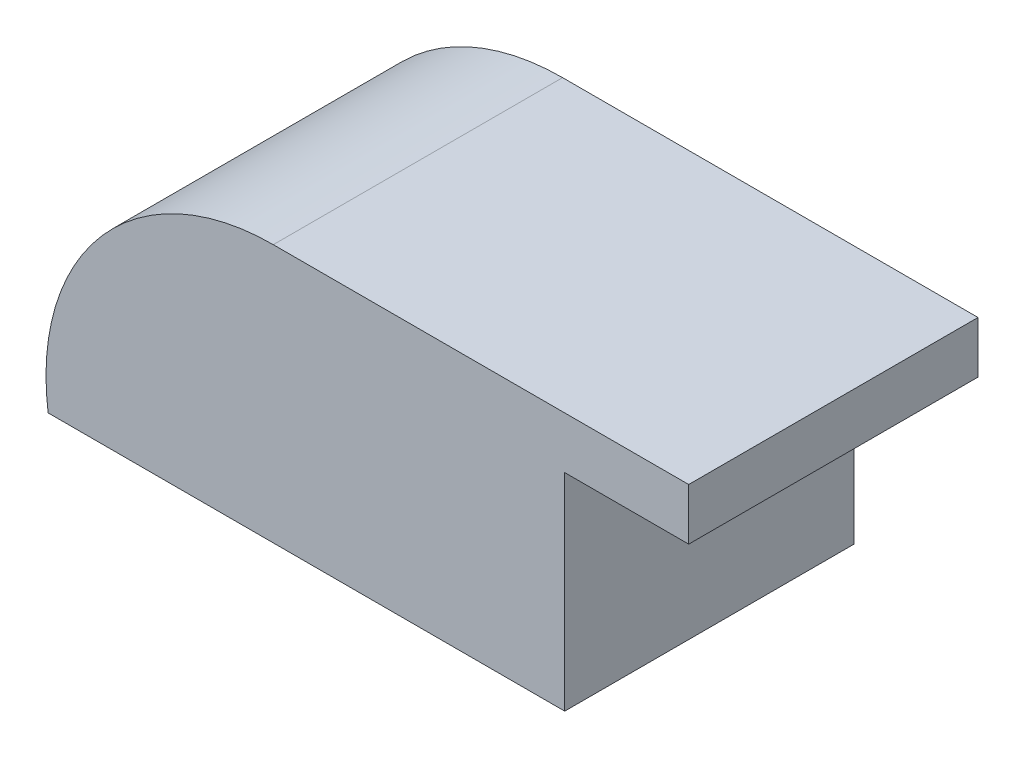
ISO-10303-21;
HEADER;
FILE_DESCRIPTION(('STEP AP214'),'2;1');
FILE_NAME('part.step','',(''),(''),'','','');
FILE_SCHEMA(('AUTOMOTIVE_DESIGN { 1 0 10303 214 1 1 1 1 }'));
ENDSEC;
DATA;
#1=APPLICATION_CONTEXT('core data for automotive mechanical design processes');
#2=APPLICATION_PROTOCOL_DEFINITION('international standard','automotive_design',2000,#1);
#3=PRODUCT_CONTEXT('',#1,'mechanical');
#4=PRODUCT('Part','Part','',(#3));
#5=PRODUCT_RELATED_PRODUCT_CATEGORY('part','',(#4));
#6=PRODUCT_DEFINITION_FORMATION('','',#4);
#7=PRODUCT_DEFINITION_CONTEXT('part definition',#1,'design');
#8=PRODUCT_DEFINITION('design','',#6,#7);
#9=PRODUCT_DEFINITION_SHAPE('','',#8);
#10=(LENGTH_UNIT() NAMED_UNIT(*) SI_UNIT(.MILLI.,.METRE.));
#11=(NAMED_UNIT(*) PLANE_ANGLE_UNIT() SI_UNIT($,.RADIAN.));
#12=(NAMED_UNIT(*) SI_UNIT($,.STERADIAN.) SOLID_ANGLE_UNIT());
#13=UNCERTAINTY_MEASURE_WITH_UNIT(LENGTH_MEASURE(1.E-05),#10,'distance_accuracy_value','');
#14=(GEOMETRIC_REPRESENTATION_CONTEXT(3) GLOBAL_UNCERTAINTY_ASSIGNED_CONTEXT((#13)) GLOBAL_UNIT_ASSIGNED_CONTEXT((#10,
#11,#12)) REPRESENTATION_CONTEXT('',''));
#15=CARTESIAN_POINT('',(0.,0.,0.));
#16=DIRECTION('',(0.,0.,1.));
#17=DIRECTION('',(1.,0.,0.));
#18=AXIS2_PLACEMENT_3D('',#15,#16,#17);
#19=CARTESIAN_POINT('',(2.07958522358267,-4.58158916212349,14.));
#20=DIRECTION('',(0.,0.,-1.));
#21=DIRECTION('',(-1.,0.,0.));
#22=AXIS2_PLACEMENT_3D('',#19,#20,#21);
#23=CYLINDRICAL_SURFACE('',#22,11.);
#24=CARTESIAN_POINT('',(2.07958522358267,-4.58158916212349,0.));
#25=DIRECTION('',(0.,0.,1.));
#26=DIRECTION('',(-1.,0.,0.));
#27=AXIS2_PLACEMENT_3D('',#24,#25,#26);
#28=CIRCLE('',#27,11.);
#29=CARTESIAN_POINT('',(2.07938913707637,6.41841083612878,0.));
#30=VERTEX_POINT('',#29);
#31=CARTESIAN_POINT('',(-8.81766213502844,-6.08158916387122,0.));
#32=VERTEX_POINT('',#31);
#33=EDGE_CURVE('E128',#30,#32,#28,.T.);
#34=ORIENTED_EDGE('',*,*,#33,.T.);
#35=DIRECTION('',(0.,0.,-1.));
#36=VECTOR('',#35,1.);
#37=CARTESIAN_POINT('',(-8.81766213502844,-6.08158916387122,14.));
#38=LINE('',#37,#36);
#39=CARTESIAN_POINT('',(-8.81766213502844,-6.08158916387122,14.));
#40=VERTEX_POINT('',#39);
#41=EDGE_CURVE('E11',#40,#32,#38,.T.);
#42=ORIENTED_EDGE('',*,*,#41,.F.);
#43=CARTESIAN_POINT('',(2.07958522358267,-4.58158916212349,14.));
#44=DIRECTION('',(0.,0.,1.));
#45=DIRECTION('',(-1.,0.,0.));
#46=AXIS2_PLACEMENT_3D('',#43,#44,#45);
#47=CIRCLE('',#46,11.);
#48=CARTESIAN_POINT('',(2.07938913707637,6.41841083612878,14.));
#49=VERTEX_POINT('',#48);
#50=EDGE_CURVE('E145',#49,#40,#47,.T.);
#51=ORIENTED_EDGE('',*,*,#50,.F.);
#52=DIRECTION('',(0.,0.,-1.));
#53=VECTOR('',#52,1.);
#54=CARTESIAN_POINT('',(2.07938913707637,6.41841083612878,14.));
#55=LINE('',#54,#53);
#56=EDGE_CURVE('E124',#49,#30,#55,.T.);
#57=ORIENTED_EDGE('',*,*,#56,.T.);
#58=EDGE_LOOP('',(#34,#42,#51,#57));
#59=FACE_BOUND('',#58,.T.);
#60=ADVANCED_FACE('F39',(#59),#23,.T.);
#61=CARTESIAN_POINT('',(-8.81766213502844,-6.08158916387122,14.));
#62=DIRECTION('',(0.,1.,0.));
#63=DIRECTION('',(0.,0.,1.));
#64=AXIS2_PLACEMENT_3D('',#61,#62,#63);
#65=PLANE('',#64);
#66=CARTESIAN_POINT('',(7.90512254753276,-6.08158916387122,7.));
#67=DIRECTION('',(0.,-1.,0.));
#68=DIRECTION('',(0.,0.,-1.));
#69=AXIS2_PLACEMENT_3D('',#66,#67,#68);
#70=CIRCLE('',#69,4.);
#71=CARTESIAN_POINT('',(7.90512254753276,-6.08158916387122,3.));
#72=VERTEX_POINT('',#71);
#73=EDGE_CURVE('E243',#72,#72,#70,.T.);
#74=ORIENTED_EDGE('',*,*,#73,.F.);
#75=EDGE_LOOP('',(#74));
#76=FACE_BOUND('',#75,.T.);
#77=DIRECTION('',(1.,0.,0.));
#78=VECTOR('',#77,1.);
#79=CARTESIAN_POINT('',(-8.81766213502844,-6.08158916387122,0.));
#80=LINE('',#79,#78);
#81=CARTESIAN_POINT('',(16.1823378649716,-6.08158916387122,0.));
#82=VERTEX_POINT('',#81);
#83=EDGE_CURVE('E132',#32,#82,#80,.T.);
#84=ORIENTED_EDGE('',*,*,#83,.T.);
#85=DIRECTION('',(0.,0.,-1.));
#86=VECTOR('',#85,1.);
#87=CARTESIAN_POINT('',(16.1823378649716,-6.08158916387122,14.));
#88=LINE('',#87,#86);
#89=CARTESIAN_POINT('',(16.1823378649716,-6.08158916387122,14.));
#90=VERTEX_POINT('',#89);
#91=EDGE_CURVE('E48',#90,#82,#88,.T.);
#92=ORIENTED_EDGE('',*,*,#91,.F.);
#93=DIRECTION('',(1.,0.,0.));
#94=VECTOR('',#93,1.);
#95=CARTESIAN_POINT('',(-8.81766213502844,-6.08158916387122,14.));
#96=LINE('',#95,#94);
#97=EDGE_CURVE('E93',#40,#90,#96,.T.);
#98=ORIENTED_EDGE('',*,*,#97,.F.);
#99=ORIENTED_EDGE('',*,*,#41,.T.);
#100=EDGE_LOOP('',(#84,#92,#98,#99));
#101=FACE_BOUND('',#100,.T.);
#102=ADVANCED_FACE('F173',(#76,#101),#65,.F.);
#103=CARTESIAN_POINT('',(16.1823378649716,-6.08158916387122,14.));
#104=DIRECTION('',(-1.,0.,0.));
#105=DIRECTION('',(0.,-1.,0.));
#106=AXIS2_PLACEMENT_3D('',#103,#104,#105);
#107=PLANE('',#106);
#108=DIRECTION('',(0.,1.,0.));
#109=VECTOR('',#108,1.);
#110=CARTESIAN_POINT('',(16.1823378649716,-6.08158916387122,0.));
#111=LINE('',#110,#109);
#112=CARTESIAN_POINT('',(16.1823378649716,3.91841083612878,0.));
#113=VERTEX_POINT('',#112);
#114=EDGE_CURVE('E136',#82,#113,#111,.T.);
#115=ORIENTED_EDGE('',*,*,#114,.T.);
#116=DIRECTION('',(0.,0.,-1.));
#117=VECTOR('',#116,1.);
#118=CARTESIAN_POINT('',(16.1823378649716,3.91841083612878,14.));
#119=LINE('',#118,#117);
#120=CARTESIAN_POINT('',(16.1823378649716,3.91841083612878,14.));
#121=VERTEX_POINT('',#120);
#122=EDGE_CURVE('E117',#121,#113,#119,.T.);
#123=ORIENTED_EDGE('',*,*,#122,.F.);
#124=DIRECTION('',(0.,1.,0.));
#125=VECTOR('',#124,1.);
#126=CARTESIAN_POINT('',(16.1823378649716,-6.08158916387122,14.));
#127=LINE('',#126,#125);
#128=EDGE_CURVE('E106',#90,#121,#127,.T.);
#129=ORIENTED_EDGE('',*,*,#128,.F.);
#130=ORIENTED_EDGE('',*,*,#91,.T.);
#131=EDGE_LOOP('',(#115,#123,#129,#130));
#132=FACE_BOUND('',#131,.T.);
#133=ADVANCED_FACE('F155',(#132),#107,.F.);
#134=CARTESIAN_POINT('',(16.1823378649716,3.91841083612878,14.));
#135=DIRECTION('',(0.,1.,0.));
#136=DIRECTION('',(0.,0.,1.));
#137=AXIS2_PLACEMENT_3D('',#134,#135,#136);
#138=PLANE('',#137);
#139=DIRECTION('',(1.,0.,0.));
#140=VECTOR('',#139,1.);
#141=CARTESIAN_POINT('',(16.1823378649716,3.91841083612878,0.));
#142=LINE('',#141,#140);
#143=CARTESIAN_POINT('',(22.1823378649716,3.91841083612878,0.));
#144=VERTEX_POINT('',#143);
#145=EDGE_CURVE('E115',#113,#144,#142,.T.);
#146=ORIENTED_EDGE('',*,*,#145,.T.);
#147=DIRECTION('',(0.,0.,-1.));
#148=VECTOR('',#147,1.);
#149=CARTESIAN_POINT('',(22.1823378649716,3.91841083612878,14.));
#150=LINE('',#149,#148);
#151=CARTESIAN_POINT('',(22.1823378649716,3.91841083612878,14.));
#152=VERTEX_POINT('',#151);
#153=EDGE_CURVE('E112',#152,#144,#150,.T.);
#154=ORIENTED_EDGE('',*,*,#153,.F.);
#155=DIRECTION('',(1.,0.,0.));
#156=VECTOR('',#155,1.);
#157=CARTESIAN_POINT('',(16.1823378649716,3.91841083612878,14.));
#158=LINE('',#157,#156);
#159=EDGE_CURVE('E100',#121,#152,#158,.T.);
#160=ORIENTED_EDGE('',*,*,#159,.F.);
#161=ORIENTED_EDGE('',*,*,#122,.T.);
#162=EDGE_LOOP('',(#146,#154,#160,#161));
#163=FACE_BOUND('',#162,.T.);
#164=ADVANCED_FACE('F113',(#163),#138,.F.);
#165=CARTESIAN_POINT('',(22.1823378649716,3.91841083612878,14.));
#166=DIRECTION('',(-1.,0.,0.));
#167=DIRECTION('',(0.,0.,1.));
#168=AXIS2_PLACEMENT_3D('',#165,#166,#167);
#169=PLANE('',#168);
#170=DIRECTION('',(0.,1.,0.));
#171=VECTOR('',#170,1.);
#172=CARTESIAN_POINT('',(22.1823378649716,3.91841083612878,0.));
#173=LINE('',#172,#171);
#174=CARTESIAN_POINT('',(22.1823378649716,6.41841083612878,0.));
#175=VERTEX_POINT('',#174);
#176=EDGE_CURVE('E79',#144,#175,#173,.T.);
#177=ORIENTED_EDGE('',*,*,#176,.T.);
#178=DIRECTION('',(0.,0.,-1.));
#179=VECTOR('',#178,1.);
#180=CARTESIAN_POINT('',(22.1823378649716,6.41841083612878,14.));
#181=LINE('',#180,#179);
#182=CARTESIAN_POINT('',(22.1823378649716,6.41841083612878,14.));
#183=VERTEX_POINT('',#182);
#184=EDGE_CURVE('E118',#183,#175,#181,.T.);
#185=ORIENTED_EDGE('',*,*,#184,.F.);
#186=DIRECTION('',(0.,1.,0.));
#187=VECTOR('',#186,1.);
#188=CARTESIAN_POINT('',(22.1823378649716,3.91841083612878,14.));
#189=LINE('',#188,#187);
#190=EDGE_CURVE('E104',#152,#183,#189,.T.);
#191=ORIENTED_EDGE('',*,*,#190,.F.);
#192=ORIENTED_EDGE('',*,*,#153,.T.);
#193=EDGE_LOOP('',(#177,#185,#191,#192));
#194=FACE_BOUND('',#193,.T.);
#195=ADVANCED_FACE('F120',(#194),#169,.F.);
#196=CARTESIAN_POINT('',(22.1823378649716,6.41841083612878,14.));
#197=DIRECTION('',(0.,-1.,0.));
#198=DIRECTION('',(1.,0.,0.));
#199=AXIS2_PLACEMENT_3D('',#196,#197,#198);
#200=PLANE('',#199);
#201=DIRECTION('',(-1.,0.,0.));
#202=VECTOR('',#201,1.);
#203=CARTESIAN_POINT('',(22.1823378649716,6.41841083612878,0.));
#204=LINE('',#203,#202);
#205=EDGE_CURVE('E85',#175,#30,#204,.T.);
#206=ORIENTED_EDGE('',*,*,#205,.T.);
#207=ORIENTED_EDGE('',*,*,#56,.F.);
#208=DIRECTION('',(-1.,0.,0.));
#209=VECTOR('',#208,1.);
#210=CARTESIAN_POINT('',(22.1823378649716,6.41841083612878,14.));
#211=LINE('',#210,#209);
#212=EDGE_CURVE('E56',#183,#49,#211,.T.);
#213=ORIENTED_EDGE('',*,*,#212,.F.);
#214=ORIENTED_EDGE('',*,*,#184,.T.);
#215=EDGE_LOOP('',(#206,#207,#213,#214));
#216=FACE_BOUND('',#215,.T.);
#217=ADVANCED_FACE('F162',(#216),#200,.F.);
#218=CARTESIAN_POINT('',(2.07958522358267,-4.58158916212349,14.));
#219=DIRECTION('',(0.,0.,-1.));
#220=DIRECTION('',(-1.,0.,0.));
#221=AXIS2_PLACEMENT_3D('',#218,#219,#220);
#222=PLANE('',#221);
#223=ORIENTED_EDGE('',*,*,#50,.T.);
#224=ORIENTED_EDGE('',*,*,#97,.T.);
#225=ORIENTED_EDGE('',*,*,#128,.T.);
#226=ORIENTED_EDGE('',*,*,#159,.T.);
#227=ORIENTED_EDGE('',*,*,#190,.T.);
#228=ORIENTED_EDGE('',*,*,#212,.T.);
#229=EDGE_LOOP('',(#223,#224,#225,#226,#227,#228));
#230=FACE_BOUND('',#229,.T.);
#231=ADVANCED_FACE('F102',(#230),#222,.F.);
#232=CARTESIAN_POINT('',(2.07958522358267,-4.58158916212349,0.));
#233=DIRECTION('',(0.,0.,-1.));
#234=DIRECTION('',(-1.,0.,0.));
#235=AXIS2_PLACEMENT_3D('',#232,#233,#234);
#236=PLANE('',#235);
#237=ORIENTED_EDGE('',*,*,#33,.F.);
#238=ORIENTED_EDGE('',*,*,#205,.F.);
#239=ORIENTED_EDGE('',*,*,#176,.F.);
#240=ORIENTED_EDGE('',*,*,#145,.F.);
#241=ORIENTED_EDGE('',*,*,#114,.F.);
#242=ORIENTED_EDGE('',*,*,#83,.F.);
#243=EDGE_LOOP('',(#237,#238,#239,#240,#241,#242));
#244=FACE_BOUND('',#243,.T.);
#245=ADVANCED_FACE('F158',(#244),#236,.T.);
#246=CARTESIAN_POINT('',(7.90512254753276,4.91841083612878,7.));
#247=DIRECTION('',(0.,-1.,0.));
#248=DIRECTION('',(0.,0.,-1.));
#249=AXIS2_PLACEMENT_3D('',#246,#247,#248);
#250=CYLINDRICAL_SURFACE('',#249,4.);
#251=CARTESIAN_POINT('',(7.90512254753276,4.91841083612878,7.));
#252=DIRECTION('',(0.,-1.,0.));
#253=DIRECTION('',(0.,0.,-1.));
#254=AXIS2_PLACEMENT_3D('',#251,#252,#253);
#255=CIRCLE('',#254,4.);
#256=CARTESIAN_POINT('',(7.90512254753276,4.91841083612878,3.));
#257=VERTEX_POINT('',#256);
#258=EDGE_CURVE('E133',#257,#257,#255,.T.);
#259=ORIENTED_EDGE('',*,*,#258,.F.);
#260=EDGE_LOOP('',(#259));
#261=FACE_BOUND('',#260,.T.);
#262=ORIENTED_EDGE('',*,*,#73,.T.);
#263=EDGE_LOOP('',(#262));
#264=FACE_BOUND('',#263,.T.);
#265=ADVANCED_FACE('F211',(#261,#264),#250,.F.);
#266=CARTESIAN_POINT('',(7.90512254753276,4.91841083612878,7.));
#267=DIRECTION('',(0.,-1.,0.));
#268=DIRECTION('',(0.,0.,-1.));
#269=AXIS2_PLACEMENT_3D('',#266,#267,#268);
#270=PLANE('',#269);
#271=ORIENTED_EDGE('',*,*,#258,.T.);
#272=EDGE_LOOP('',(#271));
#273=FACE_BOUND('',#272,.T.);
#274=ADVANCED_FACE('F226',(#273),#270,.T.);
#275=CLOSED_SHELL('',(#60,#102,#133,#164,#195,#217,#231,#245,#265,#274));
#276=MANIFOLD_SOLID_BREP('B2',#275);
#277=ADVANCED_BREP_SHAPE_REPRESENTATION('',(#18,#276),#14);
#278=SHAPE_DEFINITION_REPRESENTATION(#9,#277);
ENDSEC;
END-ISO-10303-21;
